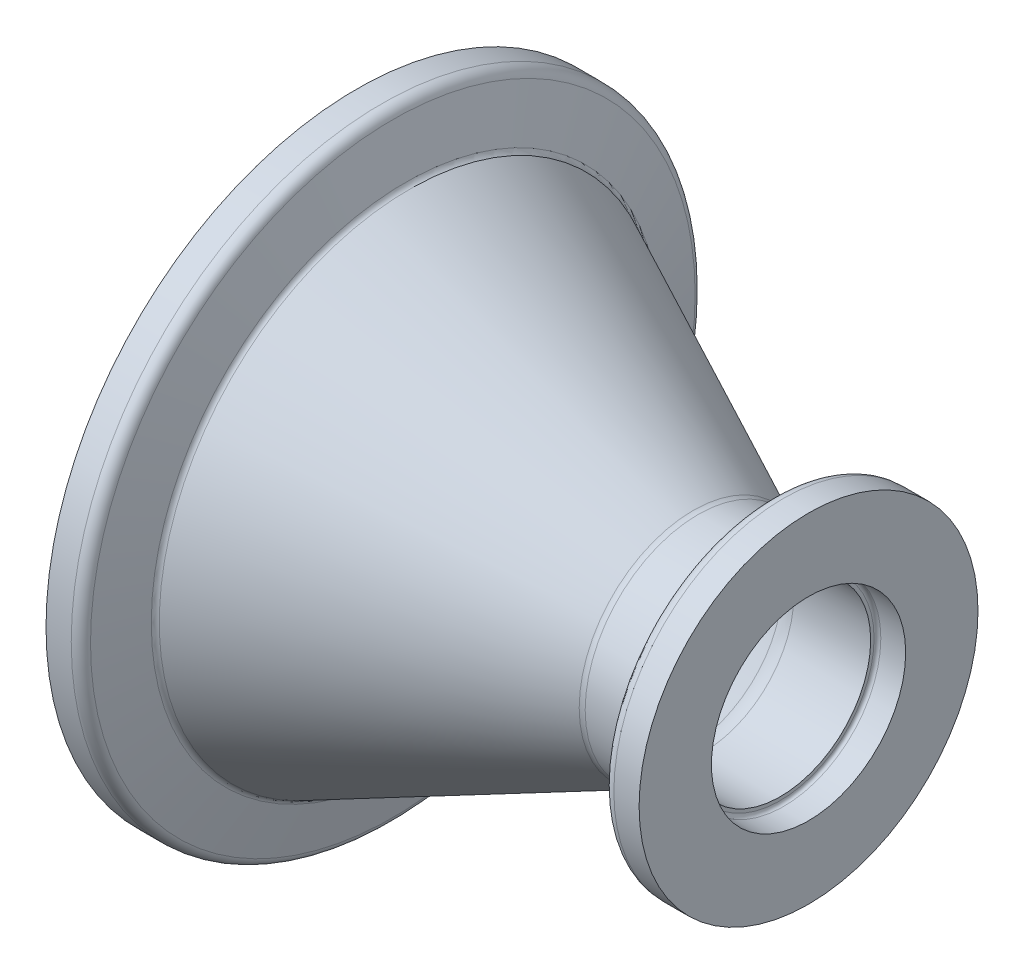
ISO-10303-21;
HEADER;
FILE_DESCRIPTION(('STEP AP214'),'2;1');
FILE_NAME('part.step','',(''),(''),'','','');
FILE_SCHEMA(('AUTOMOTIVE_DESIGN { 1 0 10303 214 1 1 1 1 }'));
ENDSEC;
DATA;
#1=APPLICATION_CONTEXT('core data for automotive mechanical design processes');
#2=APPLICATION_PROTOCOL_DEFINITION('international standard','automotive_design',2000,#1);
#3=PRODUCT_CONTEXT('',#1,'mechanical');
#4=PRODUCT('Part','Part','',(#3));
#5=PRODUCT_RELATED_PRODUCT_CATEGORY('part','',(#4));
#6=PRODUCT_DEFINITION_FORMATION('','',#4);
#7=PRODUCT_DEFINITION_CONTEXT('part definition',#1,'design');
#8=PRODUCT_DEFINITION('design','',#6,#7);
#9=PRODUCT_DEFINITION_SHAPE('','',#8);
#10=(LENGTH_UNIT() NAMED_UNIT(*) SI_UNIT(.MILLI.,.METRE.));
#11=(NAMED_UNIT(*) PLANE_ANGLE_UNIT() SI_UNIT($,.RADIAN.));
#12=(NAMED_UNIT(*) SI_UNIT($,.STERADIAN.) SOLID_ANGLE_UNIT());
#13=UNCERTAINTY_MEASURE_WITH_UNIT(LENGTH_MEASURE(1.E-05),#10,'distance_accuracy_value','');
#14=(GEOMETRIC_REPRESENTATION_CONTEXT(3) GLOBAL_UNCERTAINTY_ASSIGNED_CONTEXT((#13)) GLOBAL_UNIT_ASSIGNED_CONTEXT((#10,
#11,#12)) REPRESENTATION_CONTEXT('',''));
#15=CARTESIAN_POINT('',(0.,0.,0.));
#16=DIRECTION('',(0.,0.,1.));
#17=DIRECTION('',(1.,0.,0.));
#18=AXIS2_PLACEMENT_3D('',#15,#16,#17);
#19=CARTESIAN_POINT('',(2.5,20.25,0.));
#20=DIRECTION('',(1.,0.,0.));
#21=DIRECTION('',(0.,1.,0.));
#22=AXIS2_PLACEMENT_3D('',#19,#20,#21);
#23=PLANE('',#22);
#24=CARTESIAN_POINT('',(2.5,0.,0.));
#25=DIRECTION('',(-1.,0.,0.));
#26=DIRECTION('',(0.,0.,1.));
#27=AXIS2_PLACEMENT_3D('',#24,#25,#26);
#28=CIRCLE('',#27,20.25);
#29=CARTESIAN_POINT('',(2.5,0.,-20.25));
#30=VERTEX_POINT('',#29);
#31=EDGE_CURVE('E200',#30,#30,#28,.T.);
#32=ORIENTED_EDGE('',*,*,#31,.F.);
#33=EDGE_LOOP('',(#32));
#34=FACE_BOUND('',#33,.T.);
#35=CARTESIAN_POINT('',(2.5,0.,0.));
#36=DIRECTION('',(-1.,0.,0.));
#37=DIRECTION('',(0.,0.,-1.));
#38=AXIS2_PLACEMENT_3D('',#35,#36,#37);
#39=CIRCLE('',#38,20.3);
#40=CARTESIAN_POINT('',(2.5,0.,20.3));
#41=VERTEX_POINT('',#40);
#42=EDGE_CURVE('E281',#41,#41,#39,.T.);
#43=ORIENTED_EDGE('',*,*,#42,.T.);
#44=EDGE_LOOP('',(#43));
#45=FACE_BOUND('',#44,.T.);
#46=ADVANCED_FACE('F17',(#34,#45),#23,.F.);
#47=CARTESIAN_POINT('',(37.5,8.6,0.));
#48=DIRECTION('',(-1.,0.,0.));
#49=DIRECTION('',(0.,0.,1.));
#50=AXIS2_PLACEMENT_3D('',#47,#48,#49);
#51=PLANE('',#50);
#52=CARTESIAN_POINT('',(37.5,0.,0.));
#53=DIRECTION('',(-1.,0.,0.));
#54=DIRECTION('',(0.,0.,1.));
#55=AXIS2_PLACEMENT_3D('',#52,#53,#54);
#56=CIRCLE('',#55,8.);
#57=CARTESIAN_POINT('',(37.5,0.,-8.));
#58=VERTEX_POINT('',#57);
#59=EDGE_CURVE('E199',#58,#58,#56,.T.);
#60=ORIENTED_EDGE('',*,*,#59,.T.);
#61=EDGE_LOOP('',(#60));
#62=FACE_BOUND('',#61,.T.);
#63=CARTESIAN_POINT('',(37.5,0.,0.));
#64=DIRECTION('',(1.,0.,0.));
#65=DIRECTION('',(0.,0.,1.));
#66=AXIS2_PLACEMENT_3D('',#63,#64,#65);
#67=CIRCLE('',#66,8.3);
#68=CARTESIAN_POINT('',(37.5,0.,-8.3));
#69=VERTEX_POINT('',#68);
#70=EDGE_CURVE('E105',#69,#69,#67,.T.);
#71=ORIENTED_EDGE('',*,*,#70,.T.);
#72=EDGE_LOOP('',(#71));
#73=FACE_BOUND('',#72,.T.);
#74=ADVANCED_FACE('F638',(#62,#73),#51,.F.);
#75=CARTESIAN_POINT('',(40.,15.,0.));
#76=DIRECTION('',(-1.,0.,0.));
#77=DIRECTION('',(0.,0.,1.));
#78=AXIS2_PLACEMENT_3D('',#75,#76,#77);
#79=PLANE('',#78);
#80=CARTESIAN_POINT('',(40.,0.,0.));
#81=DIRECTION('',(-1.,0.,0.));
#82=DIRECTION('',(0.,0.,1.));
#83=AXIS2_PLACEMENT_3D('',#80,#81,#82);
#84=CIRCLE('',#83,8.6);
#85=CARTESIAN_POINT('',(40.,0.,-8.6));
#86=VERTEX_POINT('',#85);
#87=EDGE_CURVE('E229',#86,#86,#84,.T.);
#88=ORIENTED_EDGE('',*,*,#87,.T.);
#89=EDGE_LOOP('',(#88));
#90=FACE_BOUND('',#89,.T.);
#91=CARTESIAN_POINT('',(40.,0.,0.));
#92=DIRECTION('',(-1.,0.,0.));
#93=DIRECTION('',(0.,0.,1.));
#94=AXIS2_PLACEMENT_3D('',#91,#92,#93);
#95=CIRCLE('',#94,15.);
#96=CARTESIAN_POINT('',(40.,0.,-15.));
#97=VERTEX_POINT('',#96);
#98=EDGE_CURVE('E328',#97,#97,#95,.T.);
#99=ORIENTED_EDGE('',*,*,#98,.F.);
#100=EDGE_LOOP('',(#99));
#101=FACE_BOUND('',#100,.T.);
#102=ADVANCED_FACE('F19',(#90,#101),#79,.F.);
#103=CARTESIAN_POINT('',(0.,20.6,0.));
#104=DIRECTION('',(1.,0.,0.));
#105=DIRECTION('',(0.,1.,0.));
#106=AXIS2_PLACEMENT_3D('',#103,#104,#105);
#107=PLANE('',#106);
#108=CARTESIAN_POINT('',(0.,0.,0.));
#109=DIRECTION('',(-1.,0.,0.));
#110=DIRECTION('',(0.,0.,1.));
#111=AXIS2_PLACEMENT_3D('',#108,#109,#110);
#112=CIRCLE('',#111,20.6);
#113=CARTESIAN_POINT('',(0.,0.,-20.6));
#114=VERTEX_POINT('',#113);
#115=EDGE_CURVE('E11',#114,#114,#112,.T.);
#116=ORIENTED_EDGE('',*,*,#115,.F.);
#117=EDGE_LOOP('',(#116));
#118=FACE_BOUND('',#117,.T.);
#119=CARTESIAN_POINT('',(0.,0.,0.));
#120=DIRECTION('',(-1.,0.,0.));
#121=DIRECTION('',(0.,0.,1.));
#122=AXIS2_PLACEMENT_3D('',#119,#120,#121);
#123=CIRCLE('',#122,27.5);
#124=CARTESIAN_POINT('',(0.,0.,-27.5));
#125=VERTEX_POINT('',#124);
#126=EDGE_CURVE('E332',#125,#125,#123,.T.);
#127=ORIENTED_EDGE('',*,*,#126,.T.);
#128=EDGE_LOOP('',(#127));
#129=FACE_BOUND('',#128,.T.);
#130=ADVANCED_FACE('F562',(#118,#129),#107,.F.);
#131=CARTESIAN_POINT('',(0.,0.,0.));
#132=DIRECTION('',(-1.,0.,0.));
#133=DIRECTION('',(0.,0.,1.));
#134=AXIS2_PLACEMENT_3D('',#131,#132,#133);
#135=CYLINDRICAL_SURFACE('',#134,20.6);
#136=CARTESIAN_POINT('',(2.2,0.,0.));
#137=DIRECTION('',(1.,0.,0.));
#138=DIRECTION('',(0.,0.,-1.));
#139=AXIS2_PLACEMENT_3D('',#136,#137,#138);
#140=CIRCLE('',#139,20.6);
#141=CARTESIAN_POINT('',(2.2,0.,-20.6));
#142=VERTEX_POINT('',#141);
#143=CARTESIAN_POINT('',(2.2,0.,20.6));
#144=VERTEX_POINT('',#143);
#145=EDGE_CURVE('E265',#142,#144,#140,.T.);
#146=ORIENTED_EDGE('',*,*,#145,.T.);
#147=CARTESIAN_POINT('',(2.2,0.,0.));
#148=DIRECTION('',(1.,0.,0.));
#149=DIRECTION('',(0.,0.,-1.));
#150=AXIS2_PLACEMENT_3D('',#147,#148,#149);
#151=CIRCLE('',#150,20.6);
#152=EDGE_CURVE('E260',#144,#142,#151,.T.);
#153=ORIENTED_EDGE('',*,*,#152,.T.);
#154=DIRECTION('',(-1.,0.,0.));
#155=VECTOR('',#154,1.);
#156=CARTESIAN_POINT('',(0.,0.,-20.6));
#157=LINE('',#156,#155);
#158=EDGE_CURVE('E28',#142,#114,#157,.T.);
#159=ORIENTED_EDGE('',*,*,#158,.T.);
#160=ORIENTED_EDGE('',*,*,#115,.T.);
#161=ORIENTED_EDGE('',*,*,#158,.F.);
#162=EDGE_LOOP('',(#146,#153,#159,#160,#161));
#163=FACE_BOUND('',#162,.T.);
#164=ADVANCED_FACE('F553',(#163),#135,.F.);
#165=CARTESIAN_POINT('',(0.,0.,0.));
#166=DIRECTION('',(-1.,0.,0.));
#167=DIRECTION('',(0.,0.,1.));
#168=AXIS2_PLACEMENT_3D('',#165,#166,#167);
#169=CYLINDRICAL_SURFACE('',#168,27.5);
#170=ORIENTED_EDGE('',*,*,#126,.F.);
#171=DIRECTION('',(1.,0.,0.));
#172=VECTOR('',#171,1.);
#173=CARTESIAN_POINT('',(0.,0.,-27.5));
#174=LINE('',#173,#172);
#175=CARTESIAN_POINT('',(2.23267301202104,0.,-27.5));
#176=VERTEX_POINT('',#175);
#177=EDGE_CURVE('E316',#125,#176,#174,.T.);
#178=ORIENTED_EDGE('',*,*,#177,.T.);
#179=CARTESIAN_POINT('',(2.23267301202104,0.,0.));
#180=DIRECTION('',(-1.,0.,0.));
#181=DIRECTION('',(0.,0.,-1.));
#182=AXIS2_PLACEMENT_3D('',#179,#180,#181);
#183=CIRCLE('',#182,27.5);
#184=CARTESIAN_POINT('',(2.23267301202104,0.,27.5));
#185=VERTEX_POINT('',#184);
#186=EDGE_CURVE('E254',#176,#185,#183,.T.);
#187=ORIENTED_EDGE('',*,*,#186,.T.);
#188=CARTESIAN_POINT('',(2.23267301202104,0.,0.));
#189=DIRECTION('',(-1.,0.,0.));
#190=DIRECTION('',(0.,0.,-1.));
#191=AXIS2_PLACEMENT_3D('',#188,#189,#190);
#192=CIRCLE('',#191,27.5);
#193=EDGE_CURVE('E160',#185,#176,#192,.T.);
#194=ORIENTED_EDGE('',*,*,#193,.T.);
#195=ORIENTED_EDGE('',*,*,#177,.F.);
#196=EDGE_LOOP('',(#170,#178,#187,#194,#195));
#197=FACE_BOUND('',#196,.T.);
#198=ADVANCED_FACE('F536',(#197),#169,.T.);
#199=CARTESIAN_POINT('',(4.4067332602634,0.,0.));
#200=DIRECTION('',(-1.,0.,0.));
#201=DIRECTION('',(0.,0.,1.));
#202=AXIS2_PLACEMENT_3D('',#199,#200,#201);
#203=CONICAL_SURFACE('',#202,22.25,1.30899693899575);
#204=CARTESIAN_POINT('',(3.19859883831011,0.,0.));
#205=DIRECTION('',(1.,0.,0.));
#206=DIRECTION('',(0.,0.,-1.));
#207=AXIS2_PLACEMENT_3D('',#204,#205,#206);
#208=CIRCLE('',#207,26.7588190451025);
#209=CARTESIAN_POINT('',(3.19859883831011,0.,-26.7588190451025));
#210=VERTEX_POINT('',#209);
#211=CARTESIAN_POINT('',(3.19859883831011,0.,26.7588190451025));
#212=VERTEX_POINT('',#211);
#213=EDGE_CURVE('E280',#210,#212,#208,.T.);
#214=ORIENTED_EDGE('',*,*,#213,.T.);
#215=CARTESIAN_POINT('',(3.19859883831011,0.,0.));
#216=DIRECTION('',(1.,0.,0.));
#217=DIRECTION('',(0.,0.,-1.));
#218=AXIS2_PLACEMENT_3D('',#215,#216,#217);
#219=CIRCLE('',#218,26.7588190451025);
#220=EDGE_CURVE('E313',#212,#210,#219,.T.);
#221=ORIENTED_EDGE('',*,*,#220,.T.);
#222=DIRECTION('',(0.258819045102522,0.,0.965925826289068));
#223=VECTOR('',#222,1.);
#224=CARTESIAN_POINT('',(4.4067332602634,0.,-22.25));
#225=LINE('',#224,#223);
#226=CARTESIAN_POINT('',(4.33527058717238,0.,-22.5167023268204));
#227=VERTEX_POINT('',#226);
#228=EDGE_CURVE('E336',#210,#227,#225,.T.);
#229=ORIENTED_EDGE('',*,*,#228,.T.);
#230=CARTESIAN_POINT('',(4.33527058717238,0.,0.));
#231=DIRECTION('',(-1.,0.,0.));
#232=DIRECTION('',(0.,0.,1.));
#233=AXIS2_PLACEMENT_3D('',#230,#231,#232);
#234=CIRCLE('',#233,22.5167023268204);
#235=EDGE_CURVE('E284',#227,#227,#234,.T.);
#236=ORIENTED_EDGE('',*,*,#235,.T.);
#237=ORIENTED_EDGE('',*,*,#228,.F.);
#238=EDGE_LOOP('',(#214,#221,#229,#236,#237));
#239=FACE_BOUND('',#238,.T.);
#240=ADVANCED_FACE('F530',(#239),#203,.T.);
#241=CARTESIAN_POINT('',(30.,0.,0.));
#242=DIRECTION('',(-1.,0.,0.));
#243=DIRECTION('',(0.,0.,1.));
#244=AXIS2_PLACEMENT_3D('',#241,#242,#243);
#245=CONICAL_SURFACE('',#244,10.,0.446415290943158);
#246=CARTESIAN_POINT('',(4.65578513966954,0.,0.));
#247=DIRECTION('',(1.,0.,0.));
#248=DIRECTION('',(0.,0.,1.));
#249=AXIS2_PLACEMENT_3D('',#246,#247,#248);
#250=CIRCLE('',#249,22.1307934307976);
#251=CARTESIAN_POINT('',(4.65578513966954,0.,-22.1307934307976));
#252=VERTEX_POINT('',#251);
#253=EDGE_CURVE('E239',#252,#252,#250,.T.);
#254=ORIENTED_EDGE('',*,*,#253,.T.);
#255=DIRECTION('',(0.902000538473817,0.,0.43173490546045));
#256=VECTOR('',#255,1.);
#257=CARTESIAN_POINT('',(30.,0.,-10.));
#258=LINE('',#257,#256);
#259=CARTESIAN_POINT('',(29.7952549910865,0.,-10.0979994615262));
#260=VERTEX_POINT('',#259);
#261=EDGE_CURVE('E149',#252,#260,#258,.T.);
#262=ORIENTED_EDGE('',*,*,#261,.T.);
#263=CARTESIAN_POINT('',(29.7952549910865,0.,0.));
#264=DIRECTION('',(-1.,0.,0.));
#265=DIRECTION('',(0.,0.,1.));
#266=AXIS2_PLACEMENT_3D('',#263,#264,#265);
#267=CIRCLE('',#266,10.0979994615262);
#268=EDGE_CURVE('E247',#260,#260,#267,.T.);
#269=ORIENTED_EDGE('',*,*,#268,.T.);
#270=ORIENTED_EDGE('',*,*,#261,.F.);
#271=EDGE_LOOP('',(#254,#262,#269,#270));
#272=FACE_BOUND('',#271,.T.);
#273=ADVANCED_FACE('F535',(#272),#245,.T.);
#274=CARTESIAN_POINT('',(0.,0.,0.));
#275=DIRECTION('',(-1.,0.,0.));
#276=DIRECTION('',(0.,0.,1.));
#277=AXIS2_PLACEMENT_3D('',#274,#275,#276);
#278=CYLINDRICAL_SURFACE('',#277,10.);
#279=CARTESIAN_POINT('',(30.226989896547,0.,0.));
#280=DIRECTION('',(1.,0.,0.));
#281=DIRECTION('',(0.,0.,1.));
#282=AXIS2_PLACEMENT_3D('',#279,#280,#281);
#283=CIRCLE('',#282,10.);
#284=CARTESIAN_POINT('',(30.226989896547,0.,-10.));
#285=VERTEX_POINT('',#284);
#286=EDGE_CURVE('E234',#285,#285,#283,.T.);
#287=ORIENTED_EDGE('',*,*,#286,.T.);
#288=DIRECTION('',(1.,0.,0.));
#289=VECTOR('',#288,1.);
#290=CARTESIAN_POINT('',(0.,0.,-10.));
#291=LINE('',#290,#289);
#292=CARTESIAN_POINT('',(35.199857845057,0.,-10.));
#293=VERTEX_POINT('',#292);
#294=EDGE_CURVE('E138',#285,#293,#291,.T.);
#295=ORIENTED_EDGE('',*,*,#294,.T.);
#296=CARTESIAN_POINT('',(35.199857845057,0.,0.));
#297=DIRECTION('',(-1.,0.,0.));
#298=DIRECTION('',(0.,0.,1.));
#299=AXIS2_PLACEMENT_3D('',#296,#297,#298);
#300=CIRCLE('',#299,10.);
#301=EDGE_CURVE('E228',#293,#293,#300,.T.);
#302=ORIENTED_EDGE('',*,*,#301,.T.);
#303=ORIENTED_EDGE('',*,*,#294,.F.);
#304=EDGE_LOOP('',(#287,#295,#302,#303));
#305=FACE_BOUND('',#304,.T.);
#306=ADVANCED_FACE('F359',(#305),#278,.T.);
#307=CARTESIAN_POINT('',(37.,0.,0.));
#308=DIRECTION('',(1.,0.,0.));
#309=DIRECTION('',(0.,0.,-1.));
#310=AXIS2_PLACEMENT_3D('',#307,#308,#309);
#311=CONICAL_SURFACE('',#310,15.,1.30899693899575);
#312=CARTESIAN_POINT('',(36.8014011616899,0.,0.));
#313=DIRECTION('',(-1.,0.,0.));
#314=DIRECTION('',(0.,0.,1.));
#315=AXIS2_PLACEMENT_3D('',#312,#313,#314);
#316=CIRCLE('',#315,14.2588190451025);
#317=CARTESIAN_POINT('',(36.8014011616899,0.,14.2588190451025));
#318=VERTEX_POINT('',#317);
#319=EDGE_CURVE('E243',#318,#318,#316,.T.);
#320=ORIENTED_EDGE('',*,*,#319,.T.);
#321=DIRECTION('',(-0.258819045102515,0.,-0.96592582628907));
#322=VECTOR('',#321,1.);
#323=CARTESIAN_POINT('',(37.,0.,15.));
#324=LINE('',#323,#322);
#325=CARTESIAN_POINT('',(35.7794133408305,0.,10.4447085729385));
#326=VERTEX_POINT('',#325);
#327=EDGE_CURVE('E259',#318,#326,#324,.T.);
#328=ORIENTED_EDGE('',*,*,#327,.T.);
#329=CARTESIAN_POINT('',(35.7794133408305,0.,0.));
#330=DIRECTION('',(1.,0.,0.));
#331=DIRECTION('',(0.,0.,-1.));
#332=AXIS2_PLACEMENT_3D('',#329,#330,#331);
#333=CIRCLE('',#332,10.4447085729385);
#334=CARTESIAN_POINT('',(35.7794133408305,0.,-10.4447085729385));
#335=VERTEX_POINT('',#334);
#336=EDGE_CURVE('E227',#326,#335,#333,.T.);
#337=ORIENTED_EDGE('',*,*,#336,.T.);
#338=CARTESIAN_POINT('',(35.7794133408305,0.,0.));
#339=DIRECTION('',(1.,0.,0.));
#340=DIRECTION('',(0.,0.,-1.));
#341=AXIS2_PLACEMENT_3D('',#338,#339,#340);
#342=CIRCLE('',#341,10.4447085729385);
#343=EDGE_CURVE('E276',#335,#326,#342,.T.);
#344=ORIENTED_EDGE('',*,*,#343,.T.);
#345=ORIENTED_EDGE('',*,*,#327,.F.);
#346=EDGE_LOOP('',(#320,#328,#337,#344,#345));
#347=FACE_BOUND('',#346,.T.);
#348=ADVANCED_FACE('F365',(#347),#311,.T.);
#349=CARTESIAN_POINT('',(0.,0.,0.));
#350=DIRECTION('',(-1.,0.,0.));
#351=DIRECTION('',(0.,0.,1.));
#352=AXIS2_PLACEMENT_3D('',#349,#350,#351);
#353=CYLINDRICAL_SURFACE('',#352,15.);
#354=CARTESIAN_POINT('',(37.767326987979,0.,0.));
#355=DIRECTION('',(1.,0.,0.));
#356=DIRECTION('',(0.,0.,-1.));
#357=AXIS2_PLACEMENT_3D('',#354,#355,#356);
#358=CIRCLE('',#357,15.);
#359=CARTESIAN_POINT('',(37.767326987979,0.,-15.));
#360=VERTEX_POINT('',#359);
#361=CARTESIAN_POINT('',(37.767326987979,0.,15.));
#362=VERTEX_POINT('',#361);
#363=EDGE_CURVE('E273',#360,#362,#358,.T.);
#364=ORIENTED_EDGE('',*,*,#363,.T.);
#365=CARTESIAN_POINT('',(37.767326987979,0.,0.));
#366=DIRECTION('',(1.,0.,0.));
#367=DIRECTION('',(0.,0.,-1.));
#368=AXIS2_PLACEMENT_3D('',#365,#366,#367);
#369=CIRCLE('',#368,15.);
#370=EDGE_CURVE('E269',#362,#360,#369,.T.);
#371=ORIENTED_EDGE('',*,*,#370,.T.);
#372=DIRECTION('',(1.,0.,0.));
#373=VECTOR('',#372,1.);
#374=CARTESIAN_POINT('',(0.,0.,-15.));
#375=LINE('',#374,#373);
#376=EDGE_CURVE('E21',#360,#97,#375,.T.);
#377=ORIENTED_EDGE('',*,*,#376,.T.);
#378=ORIENTED_EDGE('',*,*,#98,.T.);
#379=ORIENTED_EDGE('',*,*,#376,.F.);
#380=EDGE_LOOP('',(#364,#371,#377,#378,#379));
#381=FACE_BOUND('',#380,.T.);
#382=ADVANCED_FACE('F588',(#381),#353,.T.);
#383=CARTESIAN_POINT('',(0.,0.,0.));
#384=DIRECTION('',(-1.,0.,0.));
#385=DIRECTION('',(0.,0.,1.));
#386=AXIS2_PLACEMENT_3D('',#383,#384,#385);
#387=CYLINDRICAL_SURFACE('',#386,8.6);
#388=ORIENTED_EDGE('',*,*,#87,.F.);
#389=DIRECTION('',(-1.,0.,0.));
#390=VECTOR('',#389,1.);
#391=CARTESIAN_POINT('',(0.,0.,-8.6));
#392=LINE('',#391,#390);
#393=CARTESIAN_POINT('',(37.8,0.,-8.6));
#394=VERTEX_POINT('',#393);
#395=EDGE_CURVE('E117',#86,#394,#392,.T.);
#396=ORIENTED_EDGE('',*,*,#395,.T.);
#397=CARTESIAN_POINT('',(37.8,0.,0.));
#398=DIRECTION('',(-1.,0.,0.));
#399=DIRECTION('',(0.,0.,1.));
#400=AXIS2_PLACEMENT_3D('',#397,#398,#399);
#401=CIRCLE('',#400,8.6);
#402=EDGE_CURVE('E216',#394,#394,#401,.T.);
#403=ORIENTED_EDGE('',*,*,#402,.T.);
#404=ORIENTED_EDGE('',*,*,#395,.F.);
#405=EDGE_LOOP('',(#388,#396,#403,#404));
#406=FACE_BOUND('',#405,.T.);
#407=ADVANCED_FACE('F612',(#406),#387,.F.);
#408=CARTESIAN_POINT('',(0.,0.,0.));
#409=DIRECTION('',(-1.,0.,0.));
#410=DIRECTION('',(0.,0.,1.));
#411=AXIS2_PLACEMENT_3D('',#408,#409,#410);
#412=CYLINDRICAL_SURFACE('',#411,8.);
#413=ORIENTED_EDGE('',*,*,#59,.F.);
#414=DIRECTION('',(-1.,0.,0.));
#415=VECTOR('',#414,1.);
#416=CARTESIAN_POINT('',(0.,0.,-8.));
#417=LINE('',#416,#415);
#418=CARTESIAN_POINT('',(30.6954965693038,0.,-8.));
#419=VERTEX_POINT('',#418);
#420=EDGE_CURVE('E232',#58,#419,#417,.T.);
#421=ORIENTED_EDGE('',*,*,#420,.T.);
#422=CARTESIAN_POINT('',(30.6954965693038,0.,0.));
#423=DIRECTION('',(-1.,0.,0.));
#424=DIRECTION('',(0.,0.,-1.));
#425=AXIS2_PLACEMENT_3D('',#422,#423,#424);
#426=CIRCLE('',#425,8.);
#427=CARTESIAN_POINT('',(30.6954965693038,0.,8.));
#428=VERTEX_POINT('',#427);
#429=EDGE_CURVE('E306',#419,#428,#426,.T.);
#430=ORIENTED_EDGE('',*,*,#429,.T.);
#431=CARTESIAN_POINT('',(30.6954965693038,0.,0.));
#432=DIRECTION('',(-1.,0.,0.));
#433=DIRECTION('',(0.,0.,-1.));
#434=AXIS2_PLACEMENT_3D('',#431,#432,#433);
#435=CIRCLE('',#434,8.);
#436=EDGE_CURVE('E218',#428,#419,#435,.T.);
#437=ORIENTED_EDGE('',*,*,#436,.T.);
#438=ORIENTED_EDGE('',*,*,#420,.F.);
#439=EDGE_LOOP('',(#413,#421,#430,#437,#438));
#440=FACE_BOUND('',#439,.T.);
#441=ADVANCED_FACE('F501',(#440),#412,.F.);
#442=CARTESIAN_POINT('',(5.,0.,0.));
#443=DIRECTION('',(-1.,0.,0.));
#444=DIRECTION('',(0.,0.,1.));
#445=AXIS2_PLACEMENT_3D('',#442,#443,#444);
#446=CONICAL_SURFACE('',#445,20.25,0.455615653211225);
#447=CARTESIAN_POINT('',(29.3754508259848,0.,0.));
#448=DIRECTION('',(1.,0.,0.));
#449=DIRECTION('',(0.,0.,-1.));
#450=AXIS2_PLACEMENT_3D('',#447,#448,#449);
#451=CIRCLE('',#450,8.30602909526744);
#452=CARTESIAN_POINT('',(29.3754508259848,0.,-8.30602909526744));
#453=VERTEX_POINT('',#452);
#454=CARTESIAN_POINT('',(29.3754508259848,0.,8.30602909526744));
#455=VERTEX_POINT('',#454);
#456=EDGE_CURVE('E303',#453,#455,#451,.T.);
#457=ORIENTED_EDGE('',*,*,#456,.T.);
#458=CARTESIAN_POINT('',(29.3754508259848,0.,0.));
#459=DIRECTION('',(1.,0.,0.));
#460=DIRECTION('',(0.,0.,-1.));
#461=AXIS2_PLACEMENT_3D('',#458,#459,#460);
#462=CIRCLE('',#461,8.30602909526744);
#463=EDGE_CURVE('E196',#455,#453,#462,.T.);
#464=ORIENTED_EDGE('',*,*,#463,.T.);
#465=DIRECTION('',(-0.897990301577517,0.,-0.440015247772984));
#466=VECTOR('',#465,1.);
#467=CARTESIAN_POINT('',(5.,0.,-20.25));
#468=LINE('',#467,#466);
#469=CARTESIAN_POINT('',(5.6245491740152,0.,-19.9439709047326));
#470=VERTEX_POINT('',#469);
#471=EDGE_CURVE('E189',#453,#470,#468,.T.);
#472=ORIENTED_EDGE('',*,*,#471,.T.);
#473=CARTESIAN_POINT('',(5.6245491740152,0.,0.));
#474=DIRECTION('',(-1.,0.,0.));
#475=DIRECTION('',(0.,0.,1.));
#476=AXIS2_PLACEMENT_3D('',#473,#474,#475);
#477=CIRCLE('',#476,19.9439709047326);
#478=EDGE_CURVE('E194',#470,#470,#477,.T.);
#479=ORIENTED_EDGE('',*,*,#478,.T.);
#480=ORIENTED_EDGE('',*,*,#471,.F.);
#481=EDGE_LOOP('',(#457,#464,#472,#479,#480));
#482=FACE_BOUND('',#481,.T.);
#483=ADVANCED_FACE('F192',(#482),#446,.F.);
#484=CARTESIAN_POINT('',(0.,0.,0.));
#485=DIRECTION('',(-1.,0.,0.));
#486=DIRECTION('',(0.,0.,1.));
#487=AXIS2_PLACEMENT_3D('',#484,#485,#486);
#488=CYLINDRICAL_SURFACE('',#487,20.25);
#489=CARTESIAN_POINT('',(4.30450343069625,0.,0.));
#490=DIRECTION('',(1.,0.,0.));
#491=DIRECTION('',(0.,0.,1.));
#492=AXIS2_PLACEMENT_3D('',#489,#490,#491);
#493=CIRCLE('',#492,20.25);
#494=CARTESIAN_POINT('',(4.30450343069625,0.,-20.25));
#495=VERTEX_POINT('',#494);
#496=EDGE_CURVE('E208',#495,#495,#493,.T.);
#497=ORIENTED_EDGE('',*,*,#496,.T.);
#498=DIRECTION('',(-1.,0.,0.));
#499=VECTOR('',#498,1.);
#500=CARTESIAN_POINT('',(0.,0.,-20.25));
#501=LINE('',#500,#499);
#502=EDGE_CURVE('E236',#495,#30,#501,.T.);
#503=ORIENTED_EDGE('',*,*,#502,.T.);
#504=ORIENTED_EDGE('',*,*,#31,.T.);
#505=ORIENTED_EDGE('',*,*,#502,.F.);
#506=EDGE_LOOP('',(#497,#503,#504,#505));
#507=FACE_BOUND('',#506,.T.);
#508=ADVANCED_FACE('F500',(#507),#488,.F.);
#509=CARTESIAN_POINT('',(30.226989896547,0.,0.));
#510=DIRECTION('',(-1.,0.,0.));
#511=DIRECTION('',(0.,0.,1.));
#512=AXIS2_PLACEMENT_3D('',#509,#510,#511);
#513=TOROIDAL_SURFACE('',#512,11.,1.);
#514=ORIENTED_EDGE('',*,*,#268,.F.);
#515=CARTESIAN_POINT('',(30.226989896547,0.,-11.));
#516=DIRECTION('',(0.,1.,0.));
#517=DIRECTION('',(0.,0.,-1.));
#518=AXIS2_PLACEMENT_3D('',#515,#516,#517);
#519=CIRCLE('',#518,1.);
#520=EDGE_CURVE('E237',#260,#285,#519,.T.);
#521=ORIENTED_EDGE('',*,*,#520,.T.);
#522=ORIENTED_EDGE('',*,*,#286,.F.);
#523=ORIENTED_EDGE('',*,*,#520,.F.);
#524=EDGE_LOOP('',(#514,#521,#522,#523));
#525=FACE_BOUND('',#524,.T.);
#526=ADVANCED_FACE('F596',(#525),#513,.F.);
#527=CARTESIAN_POINT('',(37.767326987979,0.,0.));
#528=DIRECTION('',(1.,0.,0.));
#529=DIRECTION('',(0.,0.,-1.));
#530=AXIS2_PLACEMENT_3D('',#527,#528,#529);
#531=TOROIDAL_SURFACE('',#530,14.,1.);
#532=ORIENTED_EDGE('',*,*,#363,.F.);
#533=ORIENTED_EDGE('',*,*,#370,.F.);
#534=CARTESIAN_POINT('',(37.767326987979,0.,14.));
#535=DIRECTION('',(0.,-1.,0.));
#536=DIRECTION('',(0.,0.,1.));
#537=AXIS2_PLACEMENT_3D('',#534,#535,#536);
#538=CIRCLE('',#537,1.);
#539=EDGE_CURVE('E248',#362,#318,#538,.T.);
#540=ORIENTED_EDGE('',*,*,#539,.T.);
#541=ORIENTED_EDGE('',*,*,#319,.F.);
#542=ORIENTED_EDGE('',*,*,#539,.F.);
#543=EDGE_LOOP('',(#532,#533,#540,#541,#542));
#544=FACE_BOUND('',#543,.T.);
#545=ADVANCED_FACE('F524',(#544),#531,.T.);
#546=CARTESIAN_POINT('',(2.23267301202104,0.,0.));
#547=DIRECTION('',(1.,0.,0.));
#548=DIRECTION('',(0.,0.,-1.));
#549=AXIS2_PLACEMENT_3D('',#546,#547,#548);
#550=TOROIDAL_SURFACE('',#549,26.5,1.);
#551=ORIENTED_EDGE('',*,*,#213,.F.);
#552=ORIENTED_EDGE('',*,*,#220,.F.);
#553=CARTESIAN_POINT('',(2.23267301202104,0.,26.5));
#554=DIRECTION('',(0.,-1.,0.));
#555=DIRECTION('',(0.,0.,1.));
#556=AXIS2_PLACEMENT_3D('',#553,#554,#555);
#557=CIRCLE('',#556,1.);
#558=EDGE_CURVE('E168',#212,#185,#557,.T.);
#559=ORIENTED_EDGE('',*,*,#558,.T.);
#560=ORIENTED_EDGE('',*,*,#186,.F.);
#561=ORIENTED_EDGE('',*,*,#193,.F.);
#562=ORIENTED_EDGE('',*,*,#558,.F.);
#563=EDGE_LOOP('',(#551,#552,#559,#560,#561,#562));
#564=FACE_BOUND('',#563,.T.);
#565=ADVANCED_FACE('F519',(#564),#550,.T.);
#566=CARTESIAN_POINT('',(35.199857845057,0.,0.));
#567=DIRECTION('',(-1.,0.,0.));
#568=DIRECTION('',(0.,0.,1.));
#569=AXIS2_PLACEMENT_3D('',#566,#567,#568);
#570=TOROIDAL_SURFACE('',#569,10.6,0.6);
#571=ORIENTED_EDGE('',*,*,#301,.F.);
#572=CARTESIAN_POINT('',(35.199857845057,0.,-10.6));
#573=DIRECTION('',(0.,1.,0.));
#574=DIRECTION('',(0.,0.,-1.));
#575=AXIS2_PLACEMENT_3D('',#572,#573,#574);
#576=CIRCLE('',#575,0.6);
#577=EDGE_CURVE('E223',#293,#335,#576,.T.);
#578=ORIENTED_EDGE('',*,*,#577,.T.);
#579=ORIENTED_EDGE('',*,*,#336,.F.);
#580=ORIENTED_EDGE('',*,*,#343,.F.);
#581=ORIENTED_EDGE('',*,*,#577,.F.);
#582=EDGE_LOOP('',(#571,#578,#579,#580,#581));
#583=FACE_BOUND('',#582,.T.);
#584=ADVANCED_FACE('F362',(#583),#570,.F.);
#585=CARTESIAN_POINT('',(4.91482608294581,0.,0.));
#586=DIRECTION('',(-1.,0.,0.));
#587=DIRECTION('',(0.,0.,1.));
#588=AXIS2_PLACEMENT_3D('',#585,#586,#587);
#589=TOROIDAL_SURFACE('',#588,22.6719937538819,0.6);
#590=ORIENTED_EDGE('',*,*,#235,.F.);
#591=CARTESIAN_POINT('',(4.91482608294581,0.,-22.6719937538819));
#592=DIRECTION('',(0.,1.,0.));
#593=DIRECTION('',(0.,0.,-1.));
#594=AXIS2_PLACEMENT_3D('',#591,#592,#593);
#595=CIRCLE('',#594,0.6);
#596=EDGE_CURVE('E242',#227,#252,#595,.T.);
#597=ORIENTED_EDGE('',*,*,#596,.T.);
#598=ORIENTED_EDGE('',*,*,#253,.F.);
#599=ORIENTED_EDGE('',*,*,#596,.F.);
#600=EDGE_LOOP('',(#590,#597,#598,#599));
#601=FACE_BOUND('',#600,.T.);
#602=ADVANCED_FACE('F567',(#601),#589,.F.);
#603=CARTESIAN_POINT('',(2.2,0.,0.));
#604=DIRECTION('',(1.,0.,0.));
#605=DIRECTION('',(0.,0.,-1.));
#606=AXIS2_PLACEMENT_3D('',#603,#604,#605);
#607=TOROIDAL_SURFACE('',#606,20.3,0.3);
#608=ORIENTED_EDGE('',*,*,#145,.F.);
#609=ORIENTED_EDGE('',*,*,#152,.F.);
#610=CARTESIAN_POINT('',(2.2,0.,20.3));
#611=DIRECTION('',(0.,1.,0.));
#612=DIRECTION('',(0.,0.,1.));
#613=AXIS2_PLACEMENT_3D('',#610,#611,#612);
#614=CIRCLE('',#613,0.3);
#615=EDGE_CURVE('E264',#144,#41,#614,.T.);
#616=ORIENTED_EDGE('',*,*,#615,.T.);
#617=ORIENTED_EDGE('',*,*,#42,.F.);
#618=ORIENTED_EDGE('',*,*,#615,.F.);
#619=EDGE_LOOP('',(#608,#609,#616,#617,#618));
#620=FACE_BOUND('',#619,.T.);
#621=ADVANCED_FACE('F512',(#620),#607,.F.);
#622=CARTESIAN_POINT('',(37.8,0.,0.));
#623=DIRECTION('',(-1.,0.,0.));
#624=DIRECTION('',(0.,0.,1.));
#625=AXIS2_PLACEMENT_3D('',#622,#623,#624);
#626=TOROIDAL_SURFACE('',#625,8.3,0.3);
#627=ORIENTED_EDGE('',*,*,#402,.F.);
#628=CARTESIAN_POINT('',(37.8,0.,-8.3));
#629=DIRECTION('',(0.,1.,0.));
#630=DIRECTION('',(0.,0.,-1.));
#631=AXIS2_PLACEMENT_3D('',#628,#629,#630);
#632=CIRCLE('',#631,0.3);
#633=EDGE_CURVE('E268',#394,#69,#632,.T.);
#634=ORIENTED_EDGE('',*,*,#633,.T.);
#635=ORIENTED_EDGE('',*,*,#70,.F.);
#636=ORIENTED_EDGE('',*,*,#633,.F.);
#637=EDGE_LOOP('',(#627,#634,#635,#636));
#638=FACE_BOUND('',#637,.T.);
#639=ADVANCED_FACE('F507',(#638),#626,.F.);
#640=CARTESIAN_POINT('',(4.30450343069625,0.,0.));
#641=DIRECTION('',(-1.,0.,0.));
#642=DIRECTION('',(0.,0.,1.));
#643=AXIS2_PLACEMENT_3D('',#640,#641,#642);
#644=TOROIDAL_SURFACE('',#643,17.25,3.);
#645=ORIENTED_EDGE('',*,*,#478,.F.);
#646=CARTESIAN_POINT('',(4.30450343069625,0.,-17.25));
#647=DIRECTION('',(0.,1.,0.));
#648=DIRECTION('',(0.,0.,-1.));
#649=AXIS2_PLACEMENT_3D('',#646,#647,#648);
#650=CIRCLE('',#649,3.);
#651=EDGE_CURVE('E205',#470,#495,#650,.T.);
#652=ORIENTED_EDGE('',*,*,#651,.T.);
#653=ORIENTED_EDGE('',*,*,#496,.F.);
#654=ORIENTED_EDGE('',*,*,#651,.F.);
#655=EDGE_LOOP('',(#645,#652,#653,#654));
#656=FACE_BOUND('',#655,.T.);
#657=ADVANCED_FACE('F206',(#656),#644,.F.);
#658=CARTESIAN_POINT('',(30.6954965693038,0.,0.));
#659=DIRECTION('',(1.,0.,0.));
#660=DIRECTION('',(0.,0.,-1.));
#661=AXIS2_PLACEMENT_3D('',#658,#659,#660);
#662=TOROIDAL_SURFACE('',#661,11.,3.);
#663=ORIENTED_EDGE('',*,*,#456,.F.);
#664=ORIENTED_EDGE('',*,*,#463,.F.);
#665=CARTESIAN_POINT('',(30.6954965693038,0.,11.));
#666=DIRECTION('',(0.,-1.,0.));
#667=DIRECTION('',(0.,0.,1.));
#668=AXIS2_PLACEMENT_3D('',#665,#666,#667);
#669=CIRCLE('',#668,3.);
#670=EDGE_CURVE('E310',#455,#428,#669,.T.);
#671=ORIENTED_EDGE('',*,*,#670,.T.);
#672=ORIENTED_EDGE('',*,*,#429,.F.);
#673=ORIENTED_EDGE('',*,*,#436,.F.);
#674=ORIENTED_EDGE('',*,*,#670,.F.);
#675=EDGE_LOOP('',(#663,#664,#671,#672,#673,#674));
#676=FACE_BOUND('',#675,.T.);
#677=ADVANCED_FACE('F576',(#676),#662,.T.);
#678=CLOSED_SHELL('',(#46,#74,#102,#130,#164,#198,#240,#273,#306,#348,#382,#407,#441,#483,#508,
#526,#545,#565,#584,#602,#621,#639,#657,#677));
#679=MANIFOLD_SOLID_BREP('B1',#678);
#680=ADVANCED_BREP_SHAPE_REPRESENTATION('',(#18,#679),#14);
#681=SHAPE_DEFINITION_REPRESENTATION(#9,#680);
ENDSEC;
END-ISO-10303-21;
